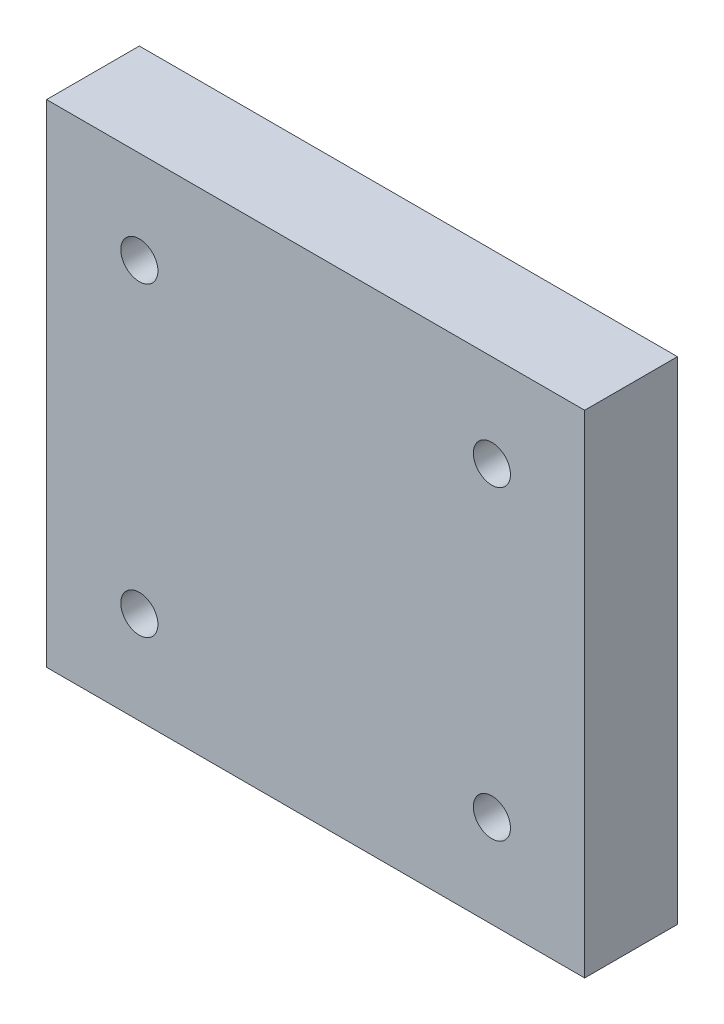
ISO-10303-21;
HEADER;
FILE_DESCRIPTION(('STEP AP214'),'2;1');
FILE_NAME('part.step','',(''),(''),'','','');
FILE_SCHEMA(('AUTOMOTIVE_DESIGN { 1 0 10303 214 1 1 1 1 }'));
ENDSEC;
DATA;
#1=APPLICATION_CONTEXT('core data for automotive mechanical design processes');
#2=APPLICATION_PROTOCOL_DEFINITION('international standard','automotive_design',2000,#1);
#3=PRODUCT_CONTEXT('',#1,'mechanical');
#4=PRODUCT('Part','Part','',(#3));
#5=PRODUCT_RELATED_PRODUCT_CATEGORY('part','',(#4));
#6=PRODUCT_DEFINITION_FORMATION('','',#4);
#7=PRODUCT_DEFINITION_CONTEXT('part definition',#1,'design');
#8=PRODUCT_DEFINITION('design','',#6,#7);
#9=PRODUCT_DEFINITION_SHAPE('','',#8);
#10=(LENGTH_UNIT() NAMED_UNIT(*) SI_UNIT(.MILLI.,.METRE.));
#11=(NAMED_UNIT(*) PLANE_ANGLE_UNIT() SI_UNIT($,.RADIAN.));
#12=(NAMED_UNIT(*) SI_UNIT($,.STERADIAN.) SOLID_ANGLE_UNIT());
#13=UNCERTAINTY_MEASURE_WITH_UNIT(LENGTH_MEASURE(1.E-05),#10,'distance_accuracy_value','');
#14=(GEOMETRIC_REPRESENTATION_CONTEXT(3) GLOBAL_UNCERTAINTY_ASSIGNED_CONTEXT((#13)) GLOBAL_UNIT_ASSIGNED_CONTEXT((#10,
#11,#12)) REPRESENTATION_CONTEXT('',''));
#15=CARTESIAN_POINT('',(0.,0.,0.));
#16=DIRECTION('',(0.,0.,1.));
#17=DIRECTION('',(1.,0.,0.));
#18=AXIS2_PLACEMENT_3D('',#15,#16,#17);
#19=CARTESIAN_POINT('',(0.,0.,5.));
#20=DIRECTION('',(0.,0.,1.));
#21=DIRECTION('',(1.,0.,0.));
#22=AXIS2_PLACEMENT_3D('',#19,#20,#21);
#23=PLANE('',#22);
#24=CARTESIAN_POINT('',(161.,134.,5.));
#25=DIRECTION('',(0.,0.,1.));
#26=DIRECTION('',(1.,0.,0.));
#27=AXIS2_PLACEMENT_3D('',#24,#25,#26);
#28=CIRCLE('',#27,0.999999999999998);
#29=CARTESIAN_POINT('',(162.,134.,5.));
#30=VERTEX_POINT('',#29);
#31=EDGE_CURVE('E12',#30,#30,#28,.F.);
#32=ORIENTED_EDGE('',*,*,#31,.T.);
#33=EDGE_LOOP('',(#32));
#34=FACE_BOUND('',#33,.T.);
#35=CARTESIAN_POINT('',(142.,117.5,5.));
#36=DIRECTION('',(0.,0.,1.));
#37=DIRECTION('',(1.,0.,0.));
#38=AXIS2_PLACEMENT_3D('',#35,#36,#37);
#39=CIRCLE('',#38,0.999999999999998);
#40=CARTESIAN_POINT('',(143.,117.5,5.));
#41=VERTEX_POINT('',#40);
#42=EDGE_CURVE('E45',#41,#41,#39,.F.);
#43=ORIENTED_EDGE('',*,*,#42,.T.);
#44=EDGE_LOOP('',(#43));
#45=FACE_BOUND('',#44,.T.);
#46=CARTESIAN_POINT('',(161.,117.5,5.));
#47=DIRECTION('',(0.,0.,1.));
#48=DIRECTION('',(1.,0.,0.));
#49=AXIS2_PLACEMENT_3D('',#46,#47,#48);
#50=CIRCLE('',#49,0.999999999999998);
#51=CARTESIAN_POINT('',(162.,117.5,5.));
#52=VERTEX_POINT('',#51);
#53=EDGE_CURVE('E116',#52,#52,#50,.F.);
#54=ORIENTED_EDGE('',*,*,#53,.T.);
#55=EDGE_LOOP('',(#54));
#56=FACE_BOUND('',#55,.T.);
#57=CARTESIAN_POINT('',(142.,134.,5.));
#58=DIRECTION('',(0.,0.,1.));
#59=DIRECTION('',(1.,0.,0.));
#60=AXIS2_PLACEMENT_3D('',#57,#58,#59);
#61=CIRCLE('',#60,0.999999999999998);
#62=CARTESIAN_POINT('',(143.,134.,5.));
#63=VERTEX_POINT('',#62);
#64=EDGE_CURVE('E113',#63,#63,#61,.F.);
#65=ORIENTED_EDGE('',*,*,#64,.T.);
#66=EDGE_LOOP('',(#65));
#67=FACE_BOUND('',#66,.T.);
#68=DIRECTION('',(1.,0.,0.));
#69=VECTOR('',#68,1.);
#70=CARTESIAN_POINT('',(166.,139.,5.));
#71=LINE('',#70,#69);
#72=CARTESIAN_POINT('',(137.,139.,5.));
#73=VERTEX_POINT('',#72);
#74=CARTESIAN_POINT('',(166.,139.,5.));
#75=VERTEX_POINT('',#74);
#76=EDGE_CURVE('E95',#73,#75,#71,.T.);
#77=ORIENTED_EDGE('',*,*,#76,.F.);
#78=DIRECTION('',(0.,1.,0.));
#79=VECTOR('',#78,1.);
#80=CARTESIAN_POINT('',(137.,112.5,5.));
#81=LINE('',#80,#79);
#82=CARTESIAN_POINT('',(137.,112.5,5.));
#83=VERTEX_POINT('',#82);
#84=EDGE_CURVE('E53',#83,#73,#81,.T.);
#85=ORIENTED_EDGE('',*,*,#84,.F.);
#86=DIRECTION('',(-1.,0.,0.));
#87=VECTOR('',#86,1.);
#88=CARTESIAN_POINT('',(166.,112.5,5.));
#89=LINE('',#88,#87);
#90=CARTESIAN_POINT('',(166.,112.5,5.));
#91=VERTEX_POINT('',#90);
#92=EDGE_CURVE('E83',#91,#83,#89,.T.);
#93=ORIENTED_EDGE('',*,*,#92,.F.);
#94=DIRECTION('',(0.,-1.,0.));
#95=VECTOR('',#94,1.);
#96=CARTESIAN_POINT('',(166.,112.5,5.));
#97=LINE('',#96,#95);
#98=EDGE_CURVE('E90',#75,#91,#97,.T.);
#99=ORIENTED_EDGE('',*,*,#98,.F.);
#100=EDGE_LOOP('',(#77,#85,#93,#99));
#101=FACE_BOUND('',#100,.T.);
#102=ADVANCED_FACE('F36',(#34,#45,#56,#67,#101),#23,.T.);
#103=CARTESIAN_POINT('',(0.,0.,0.));
#104=DIRECTION('',(0.,0.,1.));
#105=DIRECTION('',(1.,0.,0.));
#106=AXIS2_PLACEMENT_3D('',#103,#104,#105);
#107=PLANE('',#106);
#108=CARTESIAN_POINT('',(161.,134.,0.));
#109=DIRECTION('',(0.,0.,1.));
#110=DIRECTION('',(1.,0.,0.));
#111=AXIS2_PLACEMENT_3D('',#108,#109,#110);
#112=CIRCLE('',#111,0.999999999999998);
#113=CARTESIAN_POINT('',(162.,134.,0.));
#114=VERTEX_POINT('',#113);
#115=EDGE_CURVE('E40',#114,#114,#112,.F.);
#116=ORIENTED_EDGE('',*,*,#115,.F.);
#117=EDGE_LOOP('',(#116));
#118=FACE_BOUND('',#117,.T.);
#119=CARTESIAN_POINT('',(142.,117.5,0.));
#120=DIRECTION('',(0.,0.,1.));
#121=DIRECTION('',(1.,0.,0.));
#122=AXIS2_PLACEMENT_3D('',#119,#120,#121);
#123=CIRCLE('',#122,0.999999999999998);
#124=CARTESIAN_POINT('',(143.,117.5,0.));
#125=VERTEX_POINT('',#124);
#126=EDGE_CURVE('E125',#125,#125,#123,.F.);
#127=ORIENTED_EDGE('',*,*,#126,.F.);
#128=EDGE_LOOP('',(#127));
#129=FACE_BOUND('',#128,.T.);
#130=CARTESIAN_POINT('',(161.,117.5,0.));
#131=DIRECTION('',(0.,0.,1.));
#132=DIRECTION('',(1.,0.,0.));
#133=AXIS2_PLACEMENT_3D('',#130,#131,#132);
#134=CIRCLE('',#133,0.999999999999998);
#135=CARTESIAN_POINT('',(162.,117.5,0.));
#136=VERTEX_POINT('',#135);
#137=EDGE_CURVE('E123',#136,#136,#134,.F.);
#138=ORIENTED_EDGE('',*,*,#137,.F.);
#139=EDGE_LOOP('',(#138));
#140=FACE_BOUND('',#139,.T.);
#141=CARTESIAN_POINT('',(142.,134.,0.));
#142=DIRECTION('',(0.,0.,1.));
#143=DIRECTION('',(1.,0.,0.));
#144=AXIS2_PLACEMENT_3D('',#141,#142,#143);
#145=CIRCLE('',#144,0.999999999999998);
#146=CARTESIAN_POINT('',(143.,134.,0.));
#147=VERTEX_POINT('',#146);
#148=EDGE_CURVE('E110',#147,#147,#145,.F.);
#149=ORIENTED_EDGE('',*,*,#148,.F.);
#150=EDGE_LOOP('',(#149));
#151=FACE_BOUND('',#150,.T.);
#152=DIRECTION('',(0.,1.,0.));
#153=VECTOR('',#152,1.);
#154=CARTESIAN_POINT('',(137.,112.5,0.));
#155=LINE('',#154,#153);
#156=CARTESIAN_POINT('',(137.,112.5,0.));
#157=VERTEX_POINT('',#156);
#158=CARTESIAN_POINT('',(137.,139.,0.));
#159=VERTEX_POINT('',#158);
#160=EDGE_CURVE('E102',#157,#159,#155,.T.);
#161=ORIENTED_EDGE('',*,*,#160,.T.);
#162=DIRECTION('',(1.,0.,0.));
#163=VECTOR('',#162,1.);
#164=CARTESIAN_POINT('',(166.,139.,0.));
#165=LINE('',#164,#163);
#166=CARTESIAN_POINT('',(166.,139.,0.));
#167=VERTEX_POINT('',#166);
#168=EDGE_CURVE('E105',#159,#167,#165,.T.);
#169=ORIENTED_EDGE('',*,*,#168,.T.);
#170=DIRECTION('',(0.,-1.,0.));
#171=VECTOR('',#170,1.);
#172=CARTESIAN_POINT('',(166.,112.5,0.));
#173=LINE('',#172,#171);
#174=CARTESIAN_POINT('',(166.,112.5,0.));
#175=VERTEX_POINT('',#174);
#176=EDGE_CURVE('E61',#167,#175,#173,.T.);
#177=ORIENTED_EDGE('',*,*,#176,.T.);
#178=DIRECTION('',(-1.,0.,0.));
#179=VECTOR('',#178,1.);
#180=CARTESIAN_POINT('',(166.,112.5,0.));
#181=LINE('',#180,#179);
#182=EDGE_CURVE('E85',#175,#157,#181,.T.);
#183=ORIENTED_EDGE('',*,*,#182,.T.);
#184=EDGE_LOOP('',(#161,#169,#177,#183));
#185=FACE_BOUND('',#184,.T.);
#186=ADVANCED_FACE('F134',(#118,#129,#140,#151,#185),#107,.F.);
#187=CARTESIAN_POINT('',(142.,117.5,5.));
#188=DIRECTION('',(0.,0.,-1.));
#189=DIRECTION('',(-1.,0.,0.));
#190=AXIS2_PLACEMENT_3D('',#187,#188,#189);
#191=CYLINDRICAL_SURFACE('',#190,0.999999999999998);
#192=ORIENTED_EDGE('',*,*,#42,.F.);
#193=EDGE_LOOP('',(#192));
#194=FACE_BOUND('',#193,.T.);
#195=ORIENTED_EDGE('',*,*,#126,.T.);
#196=EDGE_LOOP('',(#195));
#197=FACE_BOUND('',#196,.T.);
#198=ADVANCED_FACE('F137',(#194,#197),#191,.F.);
#199=CARTESIAN_POINT('',(161.,117.5,5.));
#200=DIRECTION('',(0.,0.,-1.));
#201=DIRECTION('',(-1.,0.,0.));
#202=AXIS2_PLACEMENT_3D('',#199,#200,#201);
#203=CYLINDRICAL_SURFACE('',#202,0.999999999999998);
#204=ORIENTED_EDGE('',*,*,#53,.F.);
#205=EDGE_LOOP('',(#204));
#206=FACE_BOUND('',#205,.T.);
#207=ORIENTED_EDGE('',*,*,#137,.T.);
#208=EDGE_LOOP('',(#207));
#209=FACE_BOUND('',#208,.T.);
#210=ADVANCED_FACE('F169',(#206,#209),#203,.F.);
#211=CARTESIAN_POINT('',(142.,134.,5.));
#212=DIRECTION('',(0.,0.,-1.));
#213=DIRECTION('',(-1.,0.,0.));
#214=AXIS2_PLACEMENT_3D('',#211,#212,#213);
#215=CYLINDRICAL_SURFACE('',#214,0.999999999999998);
#216=ORIENTED_EDGE('',*,*,#64,.F.);
#217=EDGE_LOOP('',(#216));
#218=FACE_BOUND('',#217,.T.);
#219=ORIENTED_EDGE('',*,*,#148,.T.);
#220=EDGE_LOOP('',(#219));
#221=FACE_BOUND('',#220,.T.);
#222=ADVANCED_FACE('F38',(#218,#221),#215,.F.);
#223=CARTESIAN_POINT('',(161.,134.,5.));
#224=DIRECTION('',(0.,0.,-1.));
#225=DIRECTION('',(-1.,0.,0.));
#226=AXIS2_PLACEMENT_3D('',#223,#224,#225);
#227=CYLINDRICAL_SURFACE('',#226,0.999999999999998);
#228=ORIENTED_EDGE('',*,*,#31,.F.);
#229=EDGE_LOOP('',(#228));
#230=FACE_BOUND('',#229,.T.);
#231=ORIENTED_EDGE('',*,*,#115,.T.);
#232=EDGE_LOOP('',(#231));
#233=FACE_BOUND('',#232,.T.);
#234=ADVANCED_FACE('F132',(#230,#233),#227,.F.);
#235=CARTESIAN_POINT('',(137.,112.5,5.));
#236=DIRECTION('',(-1.,0.,0.));
#237=DIRECTION('',(0.,0.,1.));
#238=AXIS2_PLACEMENT_3D('',#235,#236,#237);
#239=PLANE('',#238);
#240=ORIENTED_EDGE('',*,*,#160,.F.);
#241=DIRECTION('',(0.,0.,-1.));
#242=VECTOR('',#241,1.);
#243=CARTESIAN_POINT('',(137.,112.5,5.));
#244=LINE('',#243,#242);
#245=EDGE_CURVE('E86',#83,#157,#244,.T.);
#246=ORIENTED_EDGE('',*,*,#245,.F.);
#247=ORIENTED_EDGE('',*,*,#84,.T.);
#248=DIRECTION('',(0.,0.,-1.));
#249=VECTOR('',#248,1.);
#250=CARTESIAN_POINT('',(137.,139.,5.));
#251=LINE('',#250,#249);
#252=EDGE_CURVE('E97',#73,#159,#251,.T.);
#253=ORIENTED_EDGE('',*,*,#252,.T.);
#254=EDGE_LOOP('',(#240,#246,#247,#253));
#255=FACE_BOUND('',#254,.T.);
#256=ADVANCED_FACE('F146',(#255),#239,.T.);
#257=CARTESIAN_POINT('',(166.,112.5,5.));
#258=DIRECTION('',(0.,-1.,0.));
#259=DIRECTION('',(0.,0.,-1.));
#260=AXIS2_PLACEMENT_3D('',#257,#258,#259);
#261=PLANE('',#260);
#262=ORIENTED_EDGE('',*,*,#182,.F.);
#263=DIRECTION('',(0.,0.,-1.));
#264=VECTOR('',#263,1.);
#265=CARTESIAN_POINT('',(166.,112.5,5.));
#266=LINE('',#265,#264);
#267=EDGE_CURVE('E79',#91,#175,#266,.T.);
#268=ORIENTED_EDGE('',*,*,#267,.F.);
#269=ORIENTED_EDGE('',*,*,#92,.T.);
#270=ORIENTED_EDGE('',*,*,#245,.T.);
#271=EDGE_LOOP('',(#262,#268,#269,#270));
#272=FACE_BOUND('',#271,.T.);
#273=ADVANCED_FACE('F81',(#272),#261,.T.);
#274=CARTESIAN_POINT('',(166.,112.5,5.));
#275=DIRECTION('',(1.,0.,0.));
#276=DIRECTION('',(0.,0.,-1.));
#277=AXIS2_PLACEMENT_3D('',#274,#275,#276);
#278=PLANE('',#277);
#279=ORIENTED_EDGE('',*,*,#176,.F.);
#280=DIRECTION('',(0.,0.,-1.));
#281=VECTOR('',#280,1.);
#282=CARTESIAN_POINT('',(166.,139.,5.));
#283=LINE('',#282,#281);
#284=EDGE_CURVE('E87',#75,#167,#283,.T.);
#285=ORIENTED_EDGE('',*,*,#284,.F.);
#286=ORIENTED_EDGE('',*,*,#98,.T.);
#287=ORIENTED_EDGE('',*,*,#267,.T.);
#288=EDGE_LOOP('',(#279,#285,#286,#287));
#289=FACE_BOUND('',#288,.T.);
#290=ADVANCED_FACE('F91',(#289),#278,.T.);
#291=CARTESIAN_POINT('',(166.,139.,5.));
#292=DIRECTION('',(0.,1.,0.));
#293=DIRECTION('',(0.,0.,1.));
#294=AXIS2_PLACEMENT_3D('',#291,#292,#293);
#295=PLANE('',#294);
#296=ORIENTED_EDGE('',*,*,#168,.F.);
#297=ORIENTED_EDGE('',*,*,#252,.F.);
#298=ORIENTED_EDGE('',*,*,#76,.T.);
#299=ORIENTED_EDGE('',*,*,#284,.T.);
#300=EDGE_LOOP('',(#296,#297,#298,#299));
#301=FACE_BOUND('',#300,.T.);
#302=ADVANCED_FACE('F148',(#301),#295,.T.);
#303=CLOSED_SHELL('',(#102,#186,#198,#210,#222,#234,#256,#273,#290,#302));
#304=MANIFOLD_SOLID_BREP('B2',#303);
#305=ADVANCED_BREP_SHAPE_REPRESENTATION('',(#18,#304),#14);
#306=SHAPE_DEFINITION_REPRESENTATION(#9,#305);
ENDSEC;
END-ISO-10303-21;
